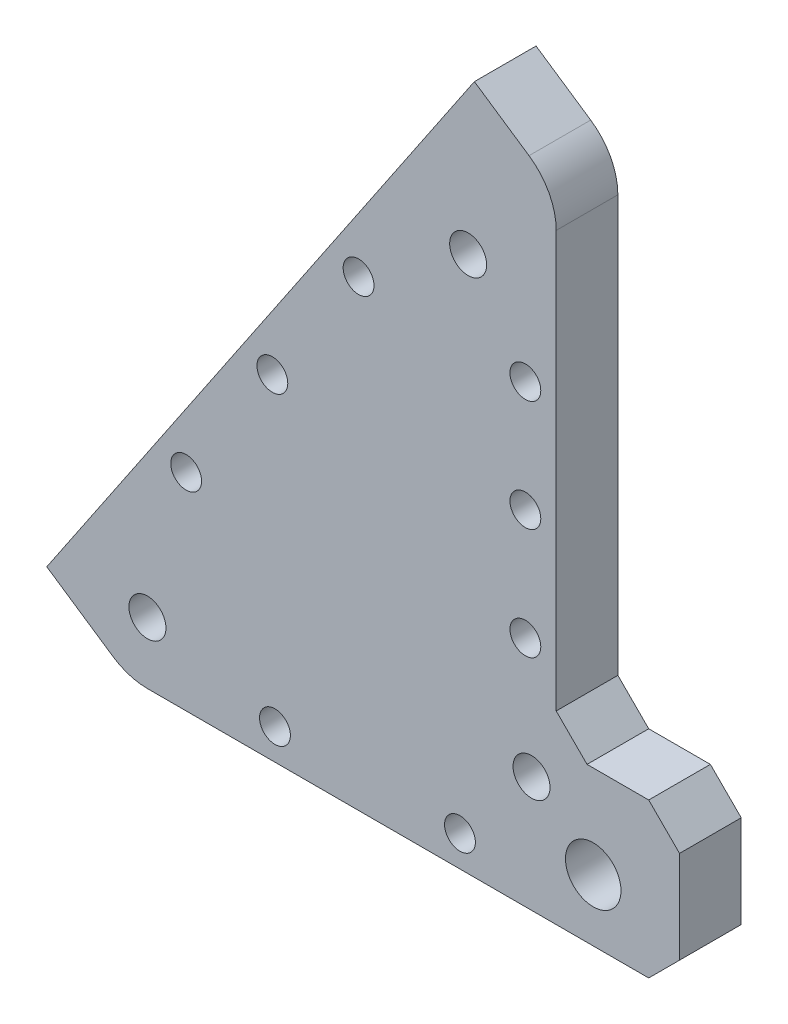
ISO-10303-21;
HEADER;
FILE_DESCRIPTION(('STEP AP214'),'2;1');
FILE_NAME('part.step','',(''),(''),'','','');
FILE_SCHEMA(('AUTOMOTIVE_DESIGN { 1 0 10303 214 1 1 1 1 }'));
ENDSEC;
DATA;
#1=APPLICATION_CONTEXT('core data for automotive mechanical design processes');
#2=APPLICATION_PROTOCOL_DEFINITION('international standard','automotive_design',2000,#1);
#3=PRODUCT_CONTEXT('',#1,'mechanical');
#4=PRODUCT('Part','Part','',(#3));
#5=PRODUCT_RELATED_PRODUCT_CATEGORY('part','',(#4));
#6=PRODUCT_DEFINITION_FORMATION('','',#4);
#7=PRODUCT_DEFINITION_CONTEXT('part definition',#1,'design');
#8=PRODUCT_DEFINITION('design','',#6,#7);
#9=PRODUCT_DEFINITION_SHAPE('','',#8);
#10=(LENGTH_UNIT() NAMED_UNIT(*) SI_UNIT(.MILLI.,.METRE.));
#11=(NAMED_UNIT(*) PLANE_ANGLE_UNIT() SI_UNIT($,.RADIAN.));
#12=(NAMED_UNIT(*) SI_UNIT($,.STERADIAN.) SOLID_ANGLE_UNIT());
#13=UNCERTAINTY_MEASURE_WITH_UNIT(LENGTH_MEASURE(1.E-05),#10,'distance_accuracy_value','');
#14=(GEOMETRIC_REPRESENTATION_CONTEXT(3) GLOBAL_UNCERTAINTY_ASSIGNED_CONTEXT((#13)) GLOBAL_UNIT_ASSIGNED_CONTEXT((#10,
#11,#12)) REPRESENTATION_CONTEXT('',''));
#15=CARTESIAN_POINT('',(0.,0.,0.));
#16=DIRECTION('',(0.,0.,1.));
#17=DIRECTION('',(1.,0.,0.));
#18=AXIS2_PLACEMENT_3D('',#15,#16,#17);
#19=CARTESIAN_POINT('',(-34.9803526201596,-45.8738727261784,10.));
#20=DIRECTION('',(0.,0.,1.));
#21=DIRECTION('',(1.,0.,0.));
#22=AXIS2_PLACEMENT_3D('',#19,#20,#21);
#23=PLANE('',#22);
#24=CARTESIAN_POINT('',(26.3022605956269,-18.1261272738216,10.));
#25=DIRECTION('',(0.,0.,1.));
#26=DIRECTION('',(1.,0.,0.));
#27=AXIS2_PLACEMENT_3D('',#24,#25,#26);
#28=CIRCLE('',#27,2.5);
#29=CARTESIAN_POINT('',(28.8022605956269,-18.1261272738216,10.));
#30=VERTEX_POINT('',#29);
#31=EDGE_CURVE('E366',#30,#30,#28,.T.);
#32=ORIENTED_EDGE('',*,*,#31,.F.);
#33=EDGE_LOOP('',(#32));
#34=FACE_BOUND('',#33,.T.);
#35=CARTESIAN_POINT('',(15.6977394043731,-50.8738727261784,10.));
#36=DIRECTION('',(0.,0.,1.));
#37=DIRECTION('',(1.,0.,0.));
#38=AXIS2_PLACEMENT_3D('',#35,#36,#37);
#39=CIRCLE('',#38,2.5);
#40=CARTESIAN_POINT('',(18.1977394043731,-50.8738727261784,10.));
#41=VERTEX_POINT('',#40);
#42=EDGE_CURVE('E382',#41,#41,#39,.T.);
#43=ORIENTED_EDGE('',*,*,#42,.F.);
#44=EDGE_LOOP('',(#43));
#45=FACE_BOUND('',#44,.T.);
#46=CARTESIAN_POINT('',(-14.3022605956269,-50.8738727261784,10.));
#47=DIRECTION('',(0.,0.,1.));
#48=DIRECTION('',(1.,0.,0.));
#49=AXIS2_PLACEMENT_3D('',#46,#47,#48);
#50=CIRCLE('',#49,2.5);
#51=CARTESIAN_POINT('',(-11.8022605956269,-50.8738727261784,10.));
#52=VERTEX_POINT('',#51);
#53=EDGE_CURVE('E398',#52,#52,#50,.T.);
#54=ORIENTED_EDGE('',*,*,#53,.F.);
#55=EDGE_LOOP('',(#54));
#56=FACE_BOUND('',#55,.T.);
#57=CARTESIAN_POINT('',(-14.7238843315481,-1.63857157980791,10.));
#58=DIRECTION('',(0.,0.,1.));
#59=DIRECTION('',(1.,0.,0.));
#60=AXIS2_PLACEMENT_3D('',#57,#58,#59);
#61=CIRCLE('',#60,2.5);
#62=CARTESIAN_POINT('',(-12.2238843315481,-1.63857157980791,10.));
#63=VERTEX_POINT('',#62);
#64=EDGE_CURVE('E414',#63,#63,#61,.T.);
#65=ORIENTED_EDGE('',*,*,#64,.F.);
#66=EDGE_LOOP('',(#65));
#67=FACE_BOUND('',#66,.T.);
#68=CARTESIAN_POINT('',(-34.9803526201596,-45.8738727261784,10.));
#69=DIRECTION('',(0.,0.,1.));
#70=DIRECTION('',(1.,0.,0.));
#71=AXIS2_PLACEMENT_3D('',#68,#69,#70);
#72=CIRCLE('',#71,3.00000000000001);
#73=CARTESIAN_POINT('',(-31.9803526201596,-45.8738727261784,10.));
#74=VERTEX_POINT('',#73);
#75=EDGE_CURVE('E430',#74,#74,#72,.T.);
#76=ORIENTED_EDGE('',*,*,#75,.F.);
#77=EDGE_LOOP('',(#76));
#78=FACE_BOUND('',#77,.T.);
#79=CARTESIAN_POINT('',(27.3022605956269,-37.1261272738216,10.));
#80=DIRECTION('',(0.,0.,1.));
#81=DIRECTION('',(1.,0.,0.));
#82=AXIS2_PLACEMENT_3D('',#79,#80,#81);
#83=CIRCLE('',#82,3.);
#84=CARTESIAN_POINT('',(30.3022605956269,-37.1261272738216,10.));
#85=VERTEX_POINT('',#84);
#86=EDGE_CURVE('E172',#85,#85,#83,.T.);
#87=ORIENTED_EDGE('',*,*,#86,.F.);
#88=EDGE_LOOP('',(#87));
#89=FACE_BOUND('',#88,.T.);
#90=CARTESIAN_POINT('',(-34.9803526201596,-45.8738727261784,10.));
#91=DIRECTION('',(0.,0.,1.));
#92=DIRECTION('',(1.,0.,0.));
#93=AXIS2_PLACEMENT_3D('',#90,#91,#92);
#94=CIRCLE('',#93,10.);
#95=CARTESIAN_POINT('',(-40.5722816548671,-54.1642484517288,10.));
#96=VERTEX_POINT('',#95);
#97=CARTESIAN_POINT('',(-34.9803526201596,-55.8738727261784,10.));
#98=VERTEX_POINT('',#97);
#99=EDGE_CURVE('E202',#96,#98,#94,.T.);
#100=ORIENTED_EDGE('',*,*,#99,.T.);
#101=DIRECTION('',(1.,0.,0.));
#102=VECTOR('',#101,1.);
#103=CARTESIAN_POINT('',(-34.9803526201596,-55.8738727261784,10.));
#104=LINE('',#103,#102);
#105=CARTESIAN_POINT('',(46.3022605956268,-55.8738727261784,10.));
#106=VERTEX_POINT('',#105);
#107=EDGE_CURVE('E114',#98,#106,#104,.T.);
#108=ORIENTED_EDGE('',*,*,#107,.T.);
#109=DIRECTION('',(0.707106781186549,0.707106781186546,0.));
#110=VECTOR('',#109,1.);
#111=CARTESIAN_POINT('',(46.3022605956268,-55.8738727261784,10.));
#112=LINE('',#111,#110);
#113=CARTESIAN_POINT('',(51.3022605956269,-50.8738727261784,10.));
#114=VERTEX_POINT('',#113);
#115=EDGE_CURVE('E239',#106,#114,#112,.T.);
#116=ORIENTED_EDGE('',*,*,#115,.T.);
#117=DIRECTION('',(0.,1.,0.));
#118=VECTOR('',#117,1.);
#119=CARTESIAN_POINT('',(51.3022605956269,-50.8738727261784,10.));
#120=LINE('',#119,#118);
#121=CARTESIAN_POINT('',(51.3022605956269,-35.8738727261784,10.));
#122=VERTEX_POINT('',#121);
#123=EDGE_CURVE('E259',#114,#122,#120,.T.);
#124=ORIENTED_EDGE('',*,*,#123,.T.);
#125=DIRECTION('',(-0.707106781186547,0.707106781186548,0.));
#126=VECTOR('',#125,1.);
#127=CARTESIAN_POINT('',(51.3022605956269,-35.8738727261784,10.));
#128=LINE('',#127,#126);
#129=CARTESIAN_POINT('',(46.3022605956269,-30.8738727261784,10.));
#130=VERTEX_POINT('',#129);
#131=EDGE_CURVE('E255',#122,#130,#128,.T.);
#132=ORIENTED_EDGE('',*,*,#131,.T.);
#133=DIRECTION('',(-1.,0.,0.));
#134=VECTOR('',#133,1.);
#135=CARTESIAN_POINT('',(46.3022605956269,-30.8738727261784,10.));
#136=LINE('',#135,#134);
#137=CARTESIAN_POINT('',(36.3022605956268,-30.8738727261784,10.));
#138=VERTEX_POINT('',#137);
#139=EDGE_CURVE('E258',#130,#138,#136,.T.);
#140=ORIENTED_EDGE('',*,*,#139,.T.);
#141=DIRECTION('',(-0.707106781186542,0.707106781186553,0.));
#142=VECTOR('',#141,1.);
#143=CARTESIAN_POINT('',(36.3022605956268,-30.8738727261784,10.));
#144=LINE('',#143,#142);
#145=CARTESIAN_POINT('',(31.3022605956269,-25.8738727261784,10.));
#146=VERTEX_POINT('',#145);
#147=EDGE_CURVE('E263',#138,#146,#144,.T.);
#148=ORIENTED_EDGE('',*,*,#147,.T.);
#149=DIRECTION('',(0.,1.,0.));
#150=VECTOR('',#149,1.);
#151=CARTESIAN_POINT('',(31.3022605956269,-25.8738727261784,10.));
#152=LINE('',#151,#150);
#153=CARTESIAN_POINT('',(31.3022605956269,41.6096919540316,10.));
#154=VERTEX_POINT('',#153);
#155=EDGE_CURVE('E270',#146,#154,#152,.T.);
#156=ORIENTED_EDGE('',*,*,#155,.T.);
#157=CARTESIAN_POINT('',(21.3022605956269,41.6096919540316,10.));
#158=DIRECTION('',(0.,0.,1.));
#159=DIRECTION('',(1.,0.,0.));
#160=AXIS2_PLACEMENT_3D('',#157,#158,#159);
#161=CIRCLE('',#160,10.);
#162=CARTESIAN_POINT('',(26.8941896303344,49.900067679582,10.));
#163=VERTEX_POINT('',#162);
#164=EDGE_CURVE('E145',#154,#163,#161,.T.);
#165=ORIENTED_EDGE('',*,*,#164,.T.);
#166=DIRECTION('',(-0.829037572555039,0.559192903470751,0.));
#167=VECTOR('',#166,1.);
#168=CARTESIAN_POINT('',(26.8941896303344,49.900067679582,10.));
#169=LINE('',#168,#167);
#170=CARTESIAN_POINT('',(18.0376594347462,55.8738727261784,10.));
#171=VERTEX_POINT('',#170);
#172=EDGE_CURVE('E139',#163,#171,#169,.T.);
#173=ORIENTED_EDGE('',*,*,#172,.T.);
#174=DIRECTION('',(-0.559192903470751,-0.829037572555039,0.));
#175=VECTOR('',#174,1.);
#176=CARTESIAN_POINT('',(18.0376594347462,55.8738727261784,10.));
#177=LINE('',#176,#175);
#178=CARTESIAN_POINT('',(-51.3022605956269,-46.9267862706464,10.));
#179=VERTEX_POINT('',#178);
#180=EDGE_CURVE('E143',#171,#179,#177,.T.);
#181=ORIENTED_EDGE('',*,*,#180,.T.);
#182=DIRECTION('',(0.829037572555039,-0.559192903470751,0.));
#183=VECTOR('',#182,1.);
#184=CARTESIAN_POINT('',(-51.3022605956269,-46.9267862706464,10.));
#185=LINE('',#184,#183);
#186=EDGE_CURVE('E59',#179,#96,#185,.T.);
#187=ORIENTED_EDGE('',*,*,#186,.T.);
#188=EDGE_LOOP('',(#100,#108,#116,#124,#132,#140,#148,#156,#165,#173,#181,#187));
#189=FACE_BOUND('',#188,.T.);
#190=CARTESIAN_POINT('',(17.0259276850338,31.1261272738216,10.));
#191=DIRECTION('',(0.,0.,1.));
#192=DIRECTION('',(1.,0.,0.));
#193=AXIS2_PLACEMENT_3D('',#190,#191,#192);
#194=CIRCLE('',#193,3.);
#195=CARTESIAN_POINT('',(20.0259276850338,31.1261272738216,10.));
#196=VERTEX_POINT('',#195);
#197=EDGE_CURVE('E438',#196,#196,#194,.T.);
#198=ORIENTED_EDGE('',*,*,#197,.F.);
#199=EDGE_LOOP('',(#198));
#200=FACE_BOUND('',#199,.T.);
#201=CARTESIAN_POINT('',(-28.7037069183169,-22.3645108936839,10.));
#202=DIRECTION('',(0.,0.,1.));
#203=DIRECTION('',(1.,0.,0.));
#204=AXIS2_PLACEMENT_3D('',#201,#202,#203);
#205=CIRCLE('',#204,2.5);
#206=CARTESIAN_POINT('',(-26.2037069183169,-22.3645108936839,10.));
#207=VERTEX_POINT('',#206);
#208=EDGE_CURVE('E422',#207,#207,#205,.T.);
#209=ORIENTED_EDGE('',*,*,#208,.F.);
#210=EDGE_LOOP('',(#209));
#211=FACE_BOUND('',#210,.T.);
#212=CARTESIAN_POINT('',(-0.744061744779353,19.0873677340681,10.));
#213=DIRECTION('',(0.,0.,1.));
#214=DIRECTION('',(1.,0.,0.));
#215=AXIS2_PLACEMENT_3D('',#212,#213,#214);
#216=CIRCLE('',#215,2.5);
#217=CARTESIAN_POINT('',(1.75593825522065,19.0873677340681,10.));
#218=VERTEX_POINT('',#217);
#219=EDGE_CURVE('E406',#218,#218,#216,.T.);
#220=ORIENTED_EDGE('',*,*,#219,.F.);
#221=EDGE_LOOP('',(#220));
#222=FACE_BOUND('',#221,.T.);
#223=CARTESIAN_POINT('',(26.3022605956269,17.8738727261784,10.));
#224=DIRECTION('',(0.,0.,1.));
#225=DIRECTION('',(1.,0.,0.));
#226=AXIS2_PLACEMENT_3D('',#223,#224,#225);
#227=CIRCLE('',#226,2.5);
#228=CARTESIAN_POINT('',(28.8022605956269,17.8738727261784,10.));
#229=VERTEX_POINT('',#228);
#230=EDGE_CURVE('E390',#229,#229,#227,.T.);
#231=ORIENTED_EDGE('',*,*,#230,.F.);
#232=EDGE_LOOP('',(#231));
#233=FACE_BOUND('',#232,.T.);
#234=CARTESIAN_POINT('',(26.3022605956269,-0.12612727382158,10.));
#235=DIRECTION('',(0.,0.,1.));
#236=DIRECTION('',(1.,0.,0.));
#237=AXIS2_PLACEMENT_3D('',#234,#235,#236);
#238=CIRCLE('',#237,2.5);
#239=CARTESIAN_POINT('',(28.8022605956269,-0.12612727382158,10.));
#240=VERTEX_POINT('',#239);
#241=EDGE_CURVE('E374',#240,#240,#238,.T.);
#242=ORIENTED_EDGE('',*,*,#241,.F.);
#243=EDGE_LOOP('',(#242));
#244=FACE_BOUND('',#243,.T.);
#245=CARTESIAN_POINT('',(37.3022605956269,-45.8738727261784,10.));
#246=DIRECTION('',(0.,0.,1.));
#247=DIRECTION('',(1.,0.,0.));
#248=AXIS2_PLACEMENT_3D('',#245,#246,#247);
#249=CIRCLE('',#248,4.5);
#250=CARTESIAN_POINT('',(41.8022605956269,-45.8738727261784,10.));
#251=VERTEX_POINT('',#250);
#252=EDGE_CURVE('E355',#251,#251,#249,.T.);
#253=ORIENTED_EDGE('',*,*,#252,.F.);
#254=EDGE_LOOP('',(#253));
#255=FACE_BOUND('',#254,.T.);
#256=ADVANCED_FACE('F41',(#34,#45,#56,#67,#78,#89,#189,#200,#211,#222,#233,#244,#255),#23,.T.);
#257=CARTESIAN_POINT('',(-34.9803526201596,-45.8738727261784,0.));
#258=DIRECTION('',(0.,0.,1.));
#259=DIRECTION('',(1.,0.,0.));
#260=AXIS2_PLACEMENT_3D('',#257,#258,#259);
#261=PLANE('',#260);
#262=CARTESIAN_POINT('',(-34.9803526201596,-45.8738727261784,0.));
#263=DIRECTION('',(0.,0.,1.));
#264=DIRECTION('',(1.,0.,0.));
#265=AXIS2_PLACEMENT_3D('',#262,#263,#264);
#266=CIRCLE('',#265,10.);
#267=CARTESIAN_POINT('',(-40.5722816548671,-54.1642484517288,0.));
#268=VERTEX_POINT('',#267);
#269=CARTESIAN_POINT('',(-34.9803526201596,-55.8738727261784,0.));
#270=VERTEX_POINT('',#269);
#271=EDGE_CURVE('E167',#268,#270,#266,.T.);
#272=ORIENTED_EDGE('',*,*,#271,.F.);
#273=DIRECTION('',(0.829037572555039,-0.559192903470751,0.));
#274=VECTOR('',#273,1.);
#275=CARTESIAN_POINT('',(-51.3022605956269,-46.9267862706464,0.));
#276=LINE('',#275,#274);
#277=CARTESIAN_POINT('',(-51.3022605956269,-46.9267862706464,0.));
#278=VERTEX_POINT('',#277);
#279=EDGE_CURVE('E106',#278,#268,#276,.T.);
#280=ORIENTED_EDGE('',*,*,#279,.F.);
#281=DIRECTION('',(-0.559192903470751,-0.829037572555039,0.));
#282=VECTOR('',#281,1.);
#283=CARTESIAN_POINT('',(18.0376594347462,55.8738727261784,0.));
#284=LINE('',#283,#282);
#285=CARTESIAN_POINT('',(18.0376594347462,55.8738727261784,0.));
#286=VERTEX_POINT('',#285);
#287=EDGE_CURVE('E100',#286,#278,#284,.T.);
#288=ORIENTED_EDGE('',*,*,#287,.F.);
#289=DIRECTION('',(-0.829037572555039,0.559192903470751,0.));
#290=VECTOR('',#289,1.);
#291=CARTESIAN_POINT('',(26.8941896303344,49.900067679582,0.));
#292=LINE('',#291,#290);
#293=CARTESIAN_POINT('',(26.8941896303344,49.900067679582,0.));
#294=VERTEX_POINT('',#293);
#295=EDGE_CURVE('E154',#294,#286,#292,.T.);
#296=ORIENTED_EDGE('',*,*,#295,.F.);
#297=CARTESIAN_POINT('',(21.3022605956269,41.6096919540316,0.));
#298=DIRECTION('',(0.,0.,1.));
#299=DIRECTION('',(1.,0.,0.));
#300=AXIS2_PLACEMENT_3D('',#297,#298,#299);
#301=CIRCLE('',#300,10.);
#302=CARTESIAN_POINT('',(31.3022605956269,41.6096919540316,0.));
#303=VERTEX_POINT('',#302);
#304=EDGE_CURVE('E193',#303,#294,#301,.T.);
#305=ORIENTED_EDGE('',*,*,#304,.F.);
#306=DIRECTION('',(0.,1.,0.));
#307=VECTOR('',#306,1.);
#308=CARTESIAN_POINT('',(31.3022605956269,-25.8738727261784,0.));
#309=LINE('',#308,#307);
#310=CARTESIAN_POINT('',(31.3022605956269,-25.8738727261784,0.));
#311=VERTEX_POINT('',#310);
#312=EDGE_CURVE('E190',#311,#303,#309,.T.);
#313=ORIENTED_EDGE('',*,*,#312,.F.);
#314=DIRECTION('',(-0.707106781186542,0.707106781186553,0.));
#315=VECTOR('',#314,1.);
#316=CARTESIAN_POINT('',(36.3022605956268,-30.8738727261784,0.));
#317=LINE('',#316,#315);
#318=CARTESIAN_POINT('',(36.3022605956268,-30.8738727261784,0.));
#319=VERTEX_POINT('',#318);
#320=EDGE_CURVE('E187',#319,#311,#317,.T.);
#321=ORIENTED_EDGE('',*,*,#320,.F.);
#322=DIRECTION('',(-1.,0.,0.));
#323=VECTOR('',#322,1.);
#324=CARTESIAN_POINT('',(46.3022605956269,-30.8738727261784,0.));
#325=LINE('',#324,#323);
#326=CARTESIAN_POINT('',(46.3022605956269,-30.8738727261784,0.));
#327=VERTEX_POINT('',#326);
#328=EDGE_CURVE('E184',#327,#319,#325,.T.);
#329=ORIENTED_EDGE('',*,*,#328,.F.);
#330=DIRECTION('',(-0.707106781186547,0.707106781186548,0.));
#331=VECTOR('',#330,1.);
#332=CARTESIAN_POINT('',(51.3022605956269,-35.8738727261784,0.));
#333=LINE('',#332,#331);
#334=CARTESIAN_POINT('',(51.3022605956269,-35.8738727261784,0.));
#335=VERTEX_POINT('',#334);
#336=EDGE_CURVE('E181',#335,#327,#333,.T.);
#337=ORIENTED_EDGE('',*,*,#336,.F.);
#338=DIRECTION('',(0.,1.,0.));
#339=VECTOR('',#338,1.);
#340=CARTESIAN_POINT('',(51.3022605956269,-50.8738727261784,0.));
#341=LINE('',#340,#339);
#342=CARTESIAN_POINT('',(51.3022605956269,-50.8738727261784,0.));
#343=VERTEX_POINT('',#342);
#344=EDGE_CURVE('E178',#343,#335,#341,.T.);
#345=ORIENTED_EDGE('',*,*,#344,.F.);
#346=DIRECTION('',(0.707106781186549,0.707106781186546,0.));
#347=VECTOR('',#346,1.);
#348=CARTESIAN_POINT('',(46.3022605956268,-55.8738727261784,0.));
#349=LINE('',#348,#347);
#350=CARTESIAN_POINT('',(46.3022605956268,-55.8738727261784,0.));
#351=VERTEX_POINT('',#350);
#352=EDGE_CURVE('E175',#351,#343,#349,.T.);
#353=ORIENTED_EDGE('',*,*,#352,.F.);
#354=DIRECTION('',(1.,0.,0.));
#355=VECTOR('',#354,1.);
#356=CARTESIAN_POINT('',(-34.9803526201596,-55.8738727261784,0.));
#357=LINE('',#356,#355);
#358=EDGE_CURVE('E171',#270,#351,#357,.T.);
#359=ORIENTED_EDGE('',*,*,#358,.F.);
#360=EDGE_LOOP('',(#272,#280,#288,#296,#305,#313,#321,#329,#337,#345,#353,#359));
#361=FACE_BOUND('',#360,.T.);
#362=CARTESIAN_POINT('',(27.3022605956269,-37.1261272738216,0.));
#363=DIRECTION('',(0.,0.,1.));
#364=DIRECTION('',(1.,0.,0.));
#365=AXIS2_PLACEMENT_3D('',#362,#363,#364);
#366=CIRCLE('',#365,3.);
#367=CARTESIAN_POINT('',(30.3022605956269,-37.1261272738216,0.));
#368=VERTEX_POINT('',#367);
#369=EDGE_CURVE('E442',#368,#368,#366,.T.);
#370=ORIENTED_EDGE('',*,*,#369,.T.);
#371=EDGE_LOOP('',(#370));
#372=FACE_BOUND('',#371,.T.);
#373=CARTESIAN_POINT('',(17.0259276850338,31.1261272738216,0.));
#374=DIRECTION('',(0.,0.,1.));
#375=DIRECTION('',(1.,0.,0.));
#376=AXIS2_PLACEMENT_3D('',#373,#374,#375);
#377=CIRCLE('',#376,3.);
#378=CARTESIAN_POINT('',(20.0259276850338,31.1261272738216,0.));
#379=VERTEX_POINT('',#378);
#380=EDGE_CURVE('E434',#379,#379,#377,.T.);
#381=ORIENTED_EDGE('',*,*,#380,.T.);
#382=EDGE_LOOP('',(#381));
#383=FACE_BOUND('',#382,.T.);
#384=CARTESIAN_POINT('',(-34.9803526201596,-45.8738727261784,0.));
#385=DIRECTION('',(0.,0.,1.));
#386=DIRECTION('',(1.,0.,0.));
#387=AXIS2_PLACEMENT_3D('',#384,#385,#386);
#388=CIRCLE('',#387,3.00000000000001);
#389=CARTESIAN_POINT('',(-31.9803526201596,-45.8738727261784,0.));
#390=VERTEX_POINT('',#389);
#391=EDGE_CURVE('E426',#390,#390,#388,.T.);
#392=ORIENTED_EDGE('',*,*,#391,.T.);
#393=EDGE_LOOP('',(#392));
#394=FACE_BOUND('',#393,.T.);
#395=CARTESIAN_POINT('',(-28.7037069183169,-22.3645108936839,0.));
#396=DIRECTION('',(0.,0.,1.));
#397=DIRECTION('',(1.,0.,0.));
#398=AXIS2_PLACEMENT_3D('',#395,#396,#397);
#399=CIRCLE('',#398,2.5);
#400=CARTESIAN_POINT('',(-26.2037069183169,-22.3645108936839,0.));
#401=VERTEX_POINT('',#400);
#402=EDGE_CURVE('E418',#401,#401,#399,.T.);
#403=ORIENTED_EDGE('',*,*,#402,.T.);
#404=EDGE_LOOP('',(#403));
#405=FACE_BOUND('',#404,.T.);
#406=CARTESIAN_POINT('',(-14.7238843315481,-1.63857157980791,0.));
#407=DIRECTION('',(0.,0.,1.));
#408=DIRECTION('',(1.,0.,0.));
#409=AXIS2_PLACEMENT_3D('',#406,#407,#408);
#410=CIRCLE('',#409,2.5);
#411=CARTESIAN_POINT('',(-12.2238843315481,-1.63857157980791,0.));
#412=VERTEX_POINT('',#411);
#413=EDGE_CURVE('E410',#412,#412,#410,.T.);
#414=ORIENTED_EDGE('',*,*,#413,.T.);
#415=EDGE_LOOP('',(#414));
#416=FACE_BOUND('',#415,.T.);
#417=CARTESIAN_POINT('',(-0.744061744779353,19.0873677340681,0.));
#418=DIRECTION('',(0.,0.,1.));
#419=DIRECTION('',(1.,0.,0.));
#420=AXIS2_PLACEMENT_3D('',#417,#418,#419);
#421=CIRCLE('',#420,2.5);
#422=CARTESIAN_POINT('',(1.75593825522065,19.0873677340681,0.));
#423=VERTEX_POINT('',#422);
#424=EDGE_CURVE('E402',#423,#423,#421,.T.);
#425=ORIENTED_EDGE('',*,*,#424,.T.);
#426=EDGE_LOOP('',(#425));
#427=FACE_BOUND('',#426,.T.);
#428=CARTESIAN_POINT('',(-14.3022605956269,-50.8738727261784,0.));
#429=DIRECTION('',(0.,0.,1.));
#430=DIRECTION('',(1.,0.,0.));
#431=AXIS2_PLACEMENT_3D('',#428,#429,#430);
#432=CIRCLE('',#431,2.5);
#433=CARTESIAN_POINT('',(-11.8022605956269,-50.8738727261784,0.));
#434=VERTEX_POINT('',#433);
#435=EDGE_CURVE('E394',#434,#434,#432,.T.);
#436=ORIENTED_EDGE('',*,*,#435,.T.);
#437=EDGE_LOOP('',(#436));
#438=FACE_BOUND('',#437,.T.);
#439=CARTESIAN_POINT('',(26.3022605956269,17.8738727261784,0.));
#440=DIRECTION('',(0.,0.,1.));
#441=DIRECTION('',(1.,0.,0.));
#442=AXIS2_PLACEMENT_3D('',#439,#440,#441);
#443=CIRCLE('',#442,2.5);
#444=CARTESIAN_POINT('',(28.8022605956269,17.8738727261784,0.));
#445=VERTEX_POINT('',#444);
#446=EDGE_CURVE('E386',#445,#445,#443,.T.);
#447=ORIENTED_EDGE('',*,*,#446,.T.);
#448=EDGE_LOOP('',(#447));
#449=FACE_BOUND('',#448,.T.);
#450=CARTESIAN_POINT('',(15.6977394043731,-50.8738727261784,0.));
#451=DIRECTION('',(0.,0.,1.));
#452=DIRECTION('',(1.,0.,0.));
#453=AXIS2_PLACEMENT_3D('',#450,#451,#452);
#454=CIRCLE('',#453,2.5);
#455=CARTESIAN_POINT('',(18.1977394043731,-50.8738727261784,0.));
#456=VERTEX_POINT('',#455);
#457=EDGE_CURVE('E378',#456,#456,#454,.T.);
#458=ORIENTED_EDGE('',*,*,#457,.T.);
#459=EDGE_LOOP('',(#458));
#460=FACE_BOUND('',#459,.T.);
#461=CARTESIAN_POINT('',(26.3022605956269,-0.12612727382158,0.));
#462=DIRECTION('',(0.,0.,1.));
#463=DIRECTION('',(1.,0.,0.));
#464=AXIS2_PLACEMENT_3D('',#461,#462,#463);
#465=CIRCLE('',#464,2.5);
#466=CARTESIAN_POINT('',(28.8022605956269,-0.12612727382158,0.));
#467=VERTEX_POINT('',#466);
#468=EDGE_CURVE('E370',#467,#467,#465,.T.);
#469=ORIENTED_EDGE('',*,*,#468,.T.);
#470=EDGE_LOOP('',(#469));
#471=FACE_BOUND('',#470,.T.);
#472=CARTESIAN_POINT('',(26.3022605956269,-18.1261272738216,0.));
#473=DIRECTION('',(0.,0.,1.));
#474=DIRECTION('',(1.,0.,0.));
#475=AXIS2_PLACEMENT_3D('',#472,#473,#474);
#476=CIRCLE('',#475,2.5);
#477=CARTESIAN_POINT('',(28.8022605956269,-18.1261272738216,0.));
#478=VERTEX_POINT('',#477);
#479=EDGE_CURVE('E363',#478,#478,#476,.T.);
#480=ORIENTED_EDGE('',*,*,#479,.T.);
#481=EDGE_LOOP('',(#480));
#482=FACE_BOUND('',#481,.T.);
#483=CARTESIAN_POINT('',(37.3022605956269,-45.8738727261784,0.));
#484=DIRECTION('',(0.,0.,1.));
#485=DIRECTION('',(1.,0.,0.));
#486=AXIS2_PLACEMENT_3D('',#483,#484,#485);
#487=CIRCLE('',#486,4.5);
#488=CARTESIAN_POINT('',(41.8022605956269,-45.8738727261784,0.));
#489=VERTEX_POINT('',#488);
#490=EDGE_CURVE('E358',#489,#489,#487,.T.);
#491=ORIENTED_EDGE('',*,*,#490,.T.);
#492=EDGE_LOOP('',(#491));
#493=FACE_BOUND('',#492,.T.);
#494=ADVANCED_FACE('F243',(#361,#372,#383,#394,#405,#416,#427,#438,#449,#460,#471,#482,#493),
#261,.F.);
#495=CARTESIAN_POINT('',(-34.9803526201596,-45.8738727261784,10.));
#496=DIRECTION('',(0.,0.,-1.));
#497=DIRECTION('',(-1.,0.,0.));
#498=AXIS2_PLACEMENT_3D('',#495,#496,#497);
#499=CYLINDRICAL_SURFACE('',#498,10.);
#500=ORIENTED_EDGE('',*,*,#271,.T.);
#501=DIRECTION('',(0.,0.,-1.));
#502=VECTOR('',#501,1.);
#503=CARTESIAN_POINT('',(-34.9803526201596,-55.8738727261784,10.));
#504=LINE('',#503,#502);
#505=EDGE_CURVE('E11',#98,#270,#504,.T.);
#506=ORIENTED_EDGE('',*,*,#505,.F.);
#507=ORIENTED_EDGE('',*,*,#99,.F.);
#508=DIRECTION('',(0.,0.,-1.));
#509=VECTOR('',#508,1.);
#510=CARTESIAN_POINT('',(-40.5722816548671,-54.1642484517288,10.));
#511=LINE('',#510,#509);
#512=EDGE_CURVE('E163',#96,#268,#511,.T.);
#513=ORIENTED_EDGE('',*,*,#512,.T.);
#514=EDGE_LOOP('',(#500,#506,#507,#513));
#515=FACE_BOUND('',#514,.T.);
#516=ADVANCED_FACE('F43',(#515),#499,.T.);
#517=CARTESIAN_POINT('',(-34.9803526201596,-55.8738727261784,10.));
#518=DIRECTION('',(0.,1.,0.));
#519=DIRECTION('',(0.,0.,1.));
#520=AXIS2_PLACEMENT_3D('',#517,#518,#519);
#521=PLANE('',#520);
#522=ORIENTED_EDGE('',*,*,#358,.T.);
#523=DIRECTION('',(0.,0.,-1.));
#524=VECTOR('',#523,1.);
#525=CARTESIAN_POINT('',(46.3022605956268,-55.8738727261784,10.));
#526=LINE('',#525,#524);
#527=EDGE_CURVE('E51',#106,#351,#526,.T.);
#528=ORIENTED_EDGE('',*,*,#527,.F.);
#529=ORIENTED_EDGE('',*,*,#107,.F.);
#530=ORIENTED_EDGE('',*,*,#505,.T.);
#531=EDGE_LOOP('',(#522,#528,#529,#530));
#532=FACE_BOUND('',#531,.T.);
#533=ADVANCED_FACE('F630',(#532),#521,.F.);
#534=CARTESIAN_POINT('',(46.3022605956268,-55.8738727261784,10.));
#535=DIRECTION('',(-0.707106781186546,0.707106781186549,0.));
#536=DIRECTION('',(-0.707106781186549,-0.707106781186546,0.));
#537=AXIS2_PLACEMENT_3D('',#534,#535,#536);
#538=PLANE('',#537);
#539=ORIENTED_EDGE('',*,*,#352,.T.);
#540=DIRECTION('',(0.,0.,-1.));
#541=VECTOR('',#540,1.);
#542=CARTESIAN_POINT('',(51.3022605956269,-50.8738727261784,10.));
#543=LINE('',#542,#541);
#544=EDGE_CURVE('E229',#114,#343,#543,.T.);
#545=ORIENTED_EDGE('',*,*,#544,.F.);
#546=ORIENTED_EDGE('',*,*,#115,.F.);
#547=ORIENTED_EDGE('',*,*,#527,.T.);
#548=EDGE_LOOP('',(#539,#545,#546,#547));
#549=FACE_BOUND('',#548,.T.);
#550=ADVANCED_FACE('F237',(#549),#538,.F.);
#551=CARTESIAN_POINT('',(51.3022605956269,-50.8738727261784,10.));
#552=DIRECTION('',(-1.,0.,0.));
#553=DIRECTION('',(0.,0.,1.));
#554=AXIS2_PLACEMENT_3D('',#551,#552,#553);
#555=PLANE('',#554);
#556=ORIENTED_EDGE('',*,*,#344,.T.);
#557=DIRECTION('',(0.,0.,-1.));
#558=VECTOR('',#557,1.);
#559=CARTESIAN_POINT('',(51.3022605956269,-35.8738727261784,10.));
#560=LINE('',#559,#558);
#561=EDGE_CURVE('E225',#122,#335,#560,.T.);
#562=ORIENTED_EDGE('',*,*,#561,.F.);
#563=ORIENTED_EDGE('',*,*,#123,.F.);
#564=ORIENTED_EDGE('',*,*,#544,.T.);
#565=EDGE_LOOP('',(#556,#562,#563,#564));
#566=FACE_BOUND('',#565,.T.);
#567=ADVANCED_FACE('F249',(#566),#555,.F.);
#568=CARTESIAN_POINT('',(51.3022605956269,-35.8738727261784,10.));
#569=DIRECTION('',(-0.707106781186548,-0.707106781186547,0.));
#570=DIRECTION('',(0.707106781186547,-0.707106781186548,0.));
#571=AXIS2_PLACEMENT_3D('',#568,#569,#570);
#572=PLANE('',#571);
#573=ORIENTED_EDGE('',*,*,#336,.T.);
#574=DIRECTION('',(0.,0.,-1.));
#575=VECTOR('',#574,1.);
#576=CARTESIAN_POINT('',(46.3022605956269,-30.8738727261784,10.));
#577=LINE('',#576,#575);
#578=EDGE_CURVE('E221',#130,#327,#577,.T.);
#579=ORIENTED_EDGE('',*,*,#578,.F.);
#580=ORIENTED_EDGE('',*,*,#131,.F.);
#581=ORIENTED_EDGE('',*,*,#561,.T.);
#582=EDGE_LOOP('',(#573,#579,#580,#581));
#583=FACE_BOUND('',#582,.T.);
#584=ADVANCED_FACE('F253',(#583),#572,.F.);
#585=CARTESIAN_POINT('',(46.3022605956269,-30.8738727261784,10.));
#586=DIRECTION('',(0.,-1.,0.));
#587=DIRECTION('',(1.,0.,0.));
#588=AXIS2_PLACEMENT_3D('',#585,#586,#587);
#589=PLANE('',#588);
#590=ORIENTED_EDGE('',*,*,#328,.T.);
#591=DIRECTION('',(0.,0.,-1.));
#592=VECTOR('',#591,1.);
#593=CARTESIAN_POINT('',(36.3022605956268,-30.8738727261784,10.));
#594=LINE('',#593,#592);
#595=EDGE_CURVE('E217',#138,#319,#594,.T.);
#596=ORIENTED_EDGE('',*,*,#595,.F.);
#597=ORIENTED_EDGE('',*,*,#139,.F.);
#598=ORIENTED_EDGE('',*,*,#578,.T.);
#599=EDGE_LOOP('',(#590,#596,#597,#598));
#600=FACE_BOUND('',#599,.T.);
#601=ADVANCED_FACE('F595',(#600),#589,.F.);
#602=CARTESIAN_POINT('',(36.3022605956268,-30.8738727261784,10.));
#603=DIRECTION('',(-0.707106781186553,-0.707106781186542,0.));
#604=DIRECTION('',(0.707106781186542,-0.707106781186553,0.));
#605=AXIS2_PLACEMENT_3D('',#602,#603,#604);
#606=PLANE('',#605);
#607=ORIENTED_EDGE('',*,*,#320,.T.);
#608=DIRECTION('',(0.,0.,-1.));
#609=VECTOR('',#608,1.);
#610=CARTESIAN_POINT('',(31.3022605956269,-25.8738727261784,10.));
#611=LINE('',#610,#609);
#612=EDGE_CURVE('E213',#146,#311,#611,.T.);
#613=ORIENTED_EDGE('',*,*,#612,.F.);
#614=ORIENTED_EDGE('',*,*,#147,.F.);
#615=ORIENTED_EDGE('',*,*,#595,.T.);
#616=EDGE_LOOP('',(#607,#613,#614,#615));
#617=FACE_BOUND('',#616,.T.);
#618=ADVANCED_FACE('F586',(#617),#606,.F.);
#619=CARTESIAN_POINT('',(31.3022605956269,-25.8738727261784,10.));
#620=DIRECTION('',(-1.,0.,0.));
#621=DIRECTION('',(0.,0.,1.));
#622=AXIS2_PLACEMENT_3D('',#619,#620,#621);
#623=PLANE('',#622);
#624=ORIENTED_EDGE('',*,*,#312,.T.);
#625=DIRECTION('',(0.,0.,-1.));
#626=VECTOR('',#625,1.);
#627=CARTESIAN_POINT('',(31.3022605956269,41.6096919540316,10.));
#628=LINE('',#627,#626);
#629=EDGE_CURVE('E209',#154,#303,#628,.T.);
#630=ORIENTED_EDGE('',*,*,#629,.F.);
#631=ORIENTED_EDGE('',*,*,#155,.F.);
#632=ORIENTED_EDGE('',*,*,#612,.T.);
#633=EDGE_LOOP('',(#624,#630,#631,#632));
#634=FACE_BOUND('',#633,.T.);
#635=ADVANCED_FACE('F278',(#634),#623,.F.);
#636=CARTESIAN_POINT('',(21.3022605956269,41.6096919540316,10.));
#637=DIRECTION('',(0.,0.,-1.));
#638=DIRECTION('',(-1.,0.,0.));
#639=AXIS2_PLACEMENT_3D('',#636,#637,#638);
#640=CYLINDRICAL_SURFACE('',#639,10.);
#641=ORIENTED_EDGE('',*,*,#304,.T.);
#642=DIRECTION('',(0.,0.,-1.));
#643=VECTOR('',#642,1.);
#644=CARTESIAN_POINT('',(26.8941896303344,49.900067679582,10.));
#645=LINE('',#644,#643);
#646=EDGE_CURVE('E156',#163,#294,#645,.T.);
#647=ORIENTED_EDGE('',*,*,#646,.F.);
#648=ORIENTED_EDGE('',*,*,#164,.F.);
#649=ORIENTED_EDGE('',*,*,#629,.T.);
#650=EDGE_LOOP('',(#641,#647,#648,#649));
#651=FACE_BOUND('',#650,.T.);
#652=ADVANCED_FACE('F282',(#651),#640,.T.);
#653=CARTESIAN_POINT('',(26.8941896303344,49.900067679582,10.));
#654=DIRECTION('',(-0.559192903470751,-0.829037572555039,0.));
#655=DIRECTION('',(0.829037572555039,-0.559192903470751,0.));
#656=AXIS2_PLACEMENT_3D('',#653,#654,#655);
#657=PLANE('',#656);
#658=ORIENTED_EDGE('',*,*,#295,.T.);
#659=DIRECTION('',(0.,0.,-1.));
#660=VECTOR('',#659,1.);
#661=CARTESIAN_POINT('',(18.0376594347462,55.8738727261784,10.));
#662=LINE('',#661,#660);
#663=EDGE_CURVE('E151',#171,#286,#662,.T.);
#664=ORIENTED_EDGE('',*,*,#663,.F.);
#665=ORIENTED_EDGE('',*,*,#172,.F.);
#666=ORIENTED_EDGE('',*,*,#646,.T.);
#667=EDGE_LOOP('',(#658,#664,#665,#666));
#668=FACE_BOUND('',#667,.T.);
#669=ADVANCED_FACE('F152',(#668),#657,.F.);
#670=CARTESIAN_POINT('',(18.0376594347462,55.8738727261784,10.));
#671=DIRECTION('',(0.829037572555039,-0.559192903470751,0.));
#672=DIRECTION('',(0.559192903470751,0.829037572555039,0.));
#673=AXIS2_PLACEMENT_3D('',#670,#671,#672);
#674=PLANE('',#673);
#675=ORIENTED_EDGE('',*,*,#287,.T.);
#676=DIRECTION('',(0.,0.,-1.));
#677=VECTOR('',#676,1.);
#678=CARTESIAN_POINT('',(-51.3022605956269,-46.9267862706464,10.));
#679=LINE('',#678,#677);
#680=EDGE_CURVE('E157',#179,#278,#679,.T.);
#681=ORIENTED_EDGE('',*,*,#680,.F.);
#682=ORIENTED_EDGE('',*,*,#180,.F.);
#683=ORIENTED_EDGE('',*,*,#663,.T.);
#684=EDGE_LOOP('',(#675,#681,#682,#683));
#685=FACE_BOUND('',#684,.T.);
#686=ADVANCED_FACE('F159',(#685),#674,.F.);
#687=CARTESIAN_POINT('',(-51.3022605956269,-46.9267862706464,10.));
#688=DIRECTION('',(0.559192903470751,0.829037572555039,0.));
#689=DIRECTION('',(-0.829037572555039,0.559192903470751,0.));
#690=AXIS2_PLACEMENT_3D('',#687,#688,#689);
#691=PLANE('',#690);
#692=ORIENTED_EDGE('',*,*,#279,.T.);
#693=ORIENTED_EDGE('',*,*,#512,.F.);
#694=ORIENTED_EDGE('',*,*,#186,.F.);
#695=ORIENTED_EDGE('',*,*,#680,.T.);
#696=EDGE_LOOP('',(#692,#693,#694,#695));
#697=FACE_BOUND('',#696,.T.);
#698=ADVANCED_FACE('F286',(#697),#691,.F.);
#699=CARTESIAN_POINT('',(27.3022605956269,-37.1261272738216,10.));
#700=DIRECTION('',(0.,0.,-1.));
#701=DIRECTION('',(-1.,0.,0.));
#702=AXIS2_PLACEMENT_3D('',#699,#700,#701);
#703=CYLINDRICAL_SURFACE('',#702,3.);
#704=ORIENTED_EDGE('',*,*,#86,.T.);
#705=EDGE_LOOP('',(#704));
#706=FACE_BOUND('',#705,.T.);
#707=ORIENTED_EDGE('',*,*,#369,.F.);
#708=EDGE_LOOP('',(#707));
#709=FACE_BOUND('',#708,.T.);
#710=ADVANCED_FACE('F288',(#706,#709),#703,.F.);
#711=CARTESIAN_POINT('',(17.0259276850338,31.1261272738216,10.));
#712=DIRECTION('',(0.,0.,-1.));
#713=DIRECTION('',(-1.,0.,0.));
#714=AXIS2_PLACEMENT_3D('',#711,#712,#713);
#715=CYLINDRICAL_SURFACE('',#714,3.);
#716=ORIENTED_EDGE('',*,*,#197,.T.);
#717=EDGE_LOOP('',(#716));
#718=FACE_BOUND('',#717,.T.);
#719=ORIENTED_EDGE('',*,*,#380,.F.);
#720=EDGE_LOOP('',(#719));
#721=FACE_BOUND('',#720,.T.);
#722=ADVANCED_FACE('F294',(#718,#721),#715,.F.);
#723=CARTESIAN_POINT('',(-34.9803526201596,-45.8738727261784,10.));
#724=DIRECTION('',(0.,0.,-1.));
#725=DIRECTION('',(-1.,0.,0.));
#726=AXIS2_PLACEMENT_3D('',#723,#724,#725);
#727=CYLINDRICAL_SURFACE('',#726,3.00000000000001);
#728=ORIENTED_EDGE('',*,*,#75,.T.);
#729=EDGE_LOOP('',(#728));
#730=FACE_BOUND('',#729,.T.);
#731=ORIENTED_EDGE('',*,*,#391,.F.);
#732=EDGE_LOOP('',(#731));
#733=FACE_BOUND('',#732,.T.);
#734=ADVANCED_FACE('F310',(#730,#733),#727,.F.);
#735=CARTESIAN_POINT('',(-28.7037069183169,-22.3645108936839,10.));
#736=DIRECTION('',(0.,0.,-1.));
#737=DIRECTION('',(-1.,0.,0.));
#738=AXIS2_PLACEMENT_3D('',#735,#736,#737);
#739=CYLINDRICAL_SURFACE('',#738,2.5);
#740=ORIENTED_EDGE('',*,*,#208,.T.);
#741=EDGE_LOOP('',(#740));
#742=FACE_BOUND('',#741,.T.);
#743=ORIENTED_EDGE('',*,*,#402,.F.);
#744=EDGE_LOOP('',(#743));
#745=FACE_BOUND('',#744,.T.);
#746=ADVANCED_FACE('F314',(#742,#745),#739,.F.);
#747=CARTESIAN_POINT('',(-14.7238843315481,-1.63857157980791,10.));
#748=DIRECTION('',(0.,0.,-1.));
#749=DIRECTION('',(-1.,0.,0.));
#750=AXIS2_PLACEMENT_3D('',#747,#748,#749);
#751=CYLINDRICAL_SURFACE('',#750,2.5);
#752=ORIENTED_EDGE('',*,*,#64,.T.);
#753=EDGE_LOOP('',(#752));
#754=FACE_BOUND('',#753,.T.);
#755=ORIENTED_EDGE('',*,*,#413,.F.);
#756=EDGE_LOOP('',(#755));
#757=FACE_BOUND('',#756,.T.);
#758=ADVANCED_FACE('F318',(#754,#757),#751,.F.);
#759=CARTESIAN_POINT('',(-0.744061744779353,19.0873677340681,10.));
#760=DIRECTION('',(0.,0.,-1.));
#761=DIRECTION('',(-1.,0.,0.));
#762=AXIS2_PLACEMENT_3D('',#759,#760,#761);
#763=CYLINDRICAL_SURFACE('',#762,2.5);
#764=ORIENTED_EDGE('',*,*,#219,.T.);
#765=EDGE_LOOP('',(#764));
#766=FACE_BOUND('',#765,.T.);
#767=ORIENTED_EDGE('',*,*,#424,.F.);
#768=EDGE_LOOP('',(#767));
#769=FACE_BOUND('',#768,.T.);
#770=ADVANCED_FACE('F322',(#766,#769),#763,.F.);
#771=CARTESIAN_POINT('',(-14.3022605956269,-50.8738727261784,10.));
#772=DIRECTION('',(0.,0.,-1.));
#773=DIRECTION('',(-1.,0.,0.));
#774=AXIS2_PLACEMENT_3D('',#771,#772,#773);
#775=CYLINDRICAL_SURFACE('',#774,2.5);
#776=ORIENTED_EDGE('',*,*,#53,.T.);
#777=EDGE_LOOP('',(#776));
#778=FACE_BOUND('',#777,.T.);
#779=ORIENTED_EDGE('',*,*,#435,.F.);
#780=EDGE_LOOP('',(#779));
#781=FACE_BOUND('',#780,.T.);
#782=ADVANCED_FACE('F326',(#778,#781),#775,.F.);
#783=CARTESIAN_POINT('',(26.3022605956269,17.8738727261784,10.));
#784=DIRECTION('',(0.,0.,-1.));
#785=DIRECTION('',(-1.,0.,0.));
#786=AXIS2_PLACEMENT_3D('',#783,#784,#785);
#787=CYLINDRICAL_SURFACE('',#786,2.5);
#788=ORIENTED_EDGE('',*,*,#230,.T.);
#789=EDGE_LOOP('',(#788));
#790=FACE_BOUND('',#789,.T.);
#791=ORIENTED_EDGE('',*,*,#446,.F.);
#792=EDGE_LOOP('',(#791));
#793=FACE_BOUND('',#792,.T.);
#794=ADVANCED_FACE('F330',(#790,#793),#787,.F.);
#795=CARTESIAN_POINT('',(15.6977394043731,-50.8738727261784,10.));
#796=DIRECTION('',(0.,0.,-1.));
#797=DIRECTION('',(-1.,0.,0.));
#798=AXIS2_PLACEMENT_3D('',#795,#796,#797);
#799=CYLINDRICAL_SURFACE('',#798,2.5);
#800=ORIENTED_EDGE('',*,*,#42,.T.);
#801=EDGE_LOOP('',(#800));
#802=FACE_BOUND('',#801,.T.);
#803=ORIENTED_EDGE('',*,*,#457,.F.);
#804=EDGE_LOOP('',(#803));
#805=FACE_BOUND('',#804,.T.);
#806=ADVANCED_FACE('F334',(#802,#805),#799,.F.);
#807=CARTESIAN_POINT('',(26.3022605956269,-0.12612727382158,10.));
#808=DIRECTION('',(0.,0.,-1.));
#809=DIRECTION('',(-1.,0.,0.));
#810=AXIS2_PLACEMENT_3D('',#807,#808,#809);
#811=CYLINDRICAL_SURFACE('',#810,2.5);
#812=ORIENTED_EDGE('',*,*,#241,.T.);
#813=EDGE_LOOP('',(#812));
#814=FACE_BOUND('',#813,.T.);
#815=ORIENTED_EDGE('',*,*,#468,.F.);
#816=EDGE_LOOP('',(#815));
#817=FACE_BOUND('',#816,.T.);
#818=ADVANCED_FACE('F338',(#814,#817),#811,.F.);
#819=CARTESIAN_POINT('',(26.3022605956269,-18.1261272738216,10.));
#820=DIRECTION('',(0.,0.,-1.));
#821=DIRECTION('',(-1.,0.,0.));
#822=AXIS2_PLACEMENT_3D('',#819,#820,#821);
#823=CYLINDRICAL_SURFACE('',#822,2.5);
#824=ORIENTED_EDGE('',*,*,#31,.T.);
#825=EDGE_LOOP('',(#824));
#826=FACE_BOUND('',#825,.T.);
#827=ORIENTED_EDGE('',*,*,#479,.F.);
#828=EDGE_LOOP('',(#827));
#829=FACE_BOUND('',#828,.T.);
#830=ADVANCED_FACE('F342',(#826,#829),#823,.F.);
#831=CARTESIAN_POINT('',(37.3022605956269,-45.8738727261784,10.));
#832=DIRECTION('',(0.,0.,-1.));
#833=DIRECTION('',(-1.,0.,0.));
#834=AXIS2_PLACEMENT_3D('',#831,#832,#833);
#835=CYLINDRICAL_SURFACE('',#834,4.5);
#836=ORIENTED_EDGE('',*,*,#252,.T.);
#837=EDGE_LOOP('',(#836));
#838=FACE_BOUND('',#837,.T.);
#839=ORIENTED_EDGE('',*,*,#490,.F.);
#840=EDGE_LOOP('',(#839));
#841=FACE_BOUND('',#840,.T.);
#842=ADVANCED_FACE('F346',(#838,#841),#835,.F.);
#843=CLOSED_SHELL('',(#256,#494,#516,#533,#550,#567,#584,#601,#618,#635,#652,#669,#686,#698,
#710,#722,#734,#746,#758,#770,#782,#794,#806,#818,#830,#842));
#844=MANIFOLD_SOLID_BREP('B2',#843);
#845=ADVANCED_BREP_SHAPE_REPRESENTATION('',(#18,#844),#14);
#846=SHAPE_DEFINITION_REPRESENTATION(#9,#845);
ENDSEC;
END-ISO-10303-21;
